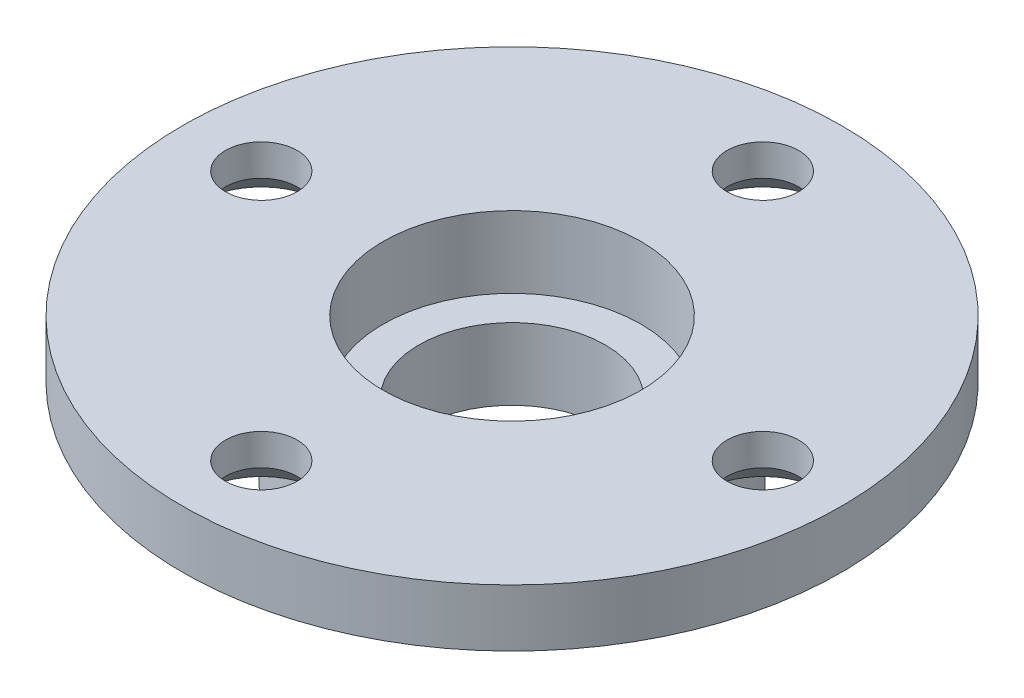
ISO-10303-21;
HEADER;
FILE_DESCRIPTION(('STEP AP214'),'2;1');
FILE_NAME('part.step','',(''),(''),'','','');
FILE_SCHEMA(('AUTOMOTIVE_DESIGN { 1 0 10303 214 1 1 1 1 }'));
ENDSEC;
DATA;
#1=APPLICATION_CONTEXT('core data for automotive mechanical design processes');
#2=APPLICATION_PROTOCOL_DEFINITION('international standard','automotive_design',2000,#1);
#3=PRODUCT_CONTEXT('',#1,'mechanical');
#4=PRODUCT('Part','Part','',(#3));
#5=PRODUCT_RELATED_PRODUCT_CATEGORY('part','',(#4));
#6=PRODUCT_DEFINITION_FORMATION('','',#4);
#7=PRODUCT_DEFINITION_CONTEXT('part definition',#1,'design');
#8=PRODUCT_DEFINITION('design','',#6,#7);
#9=PRODUCT_DEFINITION_SHAPE('','',#8);
#10=(LENGTH_UNIT() NAMED_UNIT(*) SI_UNIT(.MILLI.,.METRE.));
#11=(NAMED_UNIT(*) PLANE_ANGLE_UNIT() SI_UNIT($,.RADIAN.));
#12=(NAMED_UNIT(*) SI_UNIT($,.STERADIAN.) SOLID_ANGLE_UNIT());
#13=UNCERTAINTY_MEASURE_WITH_UNIT(LENGTH_MEASURE(1.E-05),#10,'distance_accuracy_value','');
#14=(GEOMETRIC_REPRESENTATION_CONTEXT(3) GLOBAL_UNCERTAINTY_ASSIGNED_CONTEXT((#13)) GLOBAL_UNIT_ASSIGNED_CONTEXT((#10,
#11,#12)) REPRESENTATION_CONTEXT('',''));
#15=CARTESIAN_POINT('',(0.,0.,0.));
#16=DIRECTION('',(0.,0.,1.));
#17=DIRECTION('',(1.,0.,0.));
#18=AXIS2_PLACEMENT_3D('',#15,#16,#17);
#19=CARTESIAN_POINT('',(0.,0.,0.));
#20=DIRECTION('',(0.,-1.,0.));
#21=DIRECTION('',(0.,0.,-1.));
#22=AXIS2_PLACEMENT_3D('',#19,#20,#21);
#23=CYLINDRICAL_SURFACE('',#22,6.5);
#24=CARTESIAN_POINT('',(0.,0.,0.));
#25=DIRECTION('',(0.,-1.,0.));
#26=DIRECTION('',(0.,0.,-1.));
#27=AXIS2_PLACEMENT_3D('',#24,#25,#26);
#28=CIRCLE('',#27,6.5);
#29=CARTESIAN_POINT('',(0.,0.,-6.5));
#30=VERTEX_POINT('',#29);
#31=EDGE_CURVE('E69',#30,#30,#28,.T.);
#32=ORIENTED_EDGE('',*,*,#31,.T.);
#33=EDGE_LOOP('',(#32));
#34=FACE_BOUND('',#33,.T.);
#35=CARTESIAN_POINT('',(0.,5.,0.));
#36=DIRECTION('',(0.,-1.,0.));
#37=DIRECTION('',(0.,0.,-1.));
#38=AXIS2_PLACEMENT_3D('',#35,#36,#37);
#39=CIRCLE('',#38,6.5);
#40=CARTESIAN_POINT('',(0.,5.,-6.5));
#41=VERTEX_POINT('',#40);
#42=EDGE_CURVE('E90',#41,#41,#39,.T.);
#43=ORIENTED_EDGE('',*,*,#42,.F.);
#44=EDGE_LOOP('',(#43));
#45=FACE_BOUND('',#44,.T.);
#46=ADVANCED_FACE('F36',(#34,#45),#23,.F.);
#47=CARTESIAN_POINT('',(6.5,0.,0.));
#48=DIRECTION('',(0.,-1.,0.));
#49=DIRECTION('',(0.,0.,-1.));
#50=AXIS2_PLACEMENT_3D('',#47,#48,#49);
#51=PLANE('',#50);
#52=CARTESIAN_POINT('',(0.,0.,0.));
#53=DIRECTION('',(0.,-1.,0.));
#54=DIRECTION('',(0.,0.,-1.));
#55=AXIS2_PLACEMENT_3D('',#52,#53,#54);
#56=CIRCLE('',#55,12.5);
#57=CARTESIAN_POINT('',(0.,0.,-12.5));
#58=VERTEX_POINT('',#57);
#59=EDGE_CURVE('E72',#58,#58,#56,.T.);
#60=ORIENTED_EDGE('',*,*,#59,.T.);
#61=EDGE_LOOP('',(#60));
#62=FACE_BOUND('',#61,.T.);
#63=ORIENTED_EDGE('',*,*,#31,.F.);
#64=EDGE_LOOP('',(#63));
#65=FACE_BOUND('',#64,.T.);
#66=ADVANCED_FACE('F138',(#62,#65),#51,.T.);
#67=CARTESIAN_POINT('',(0.,0.,0.));
#68=DIRECTION('',(0.,-1.,0.));
#69=DIRECTION('',(0.,0.,-1.));
#70=AXIS2_PLACEMENT_3D('',#67,#68,#69);
#71=CYLINDRICAL_SURFACE('',#70,12.5);
#72=CARTESIAN_POINT('',(0.,6.,0.));
#73=DIRECTION('',(0.,-1.,0.));
#74=DIRECTION('',(0.,0.,-1.));
#75=AXIS2_PLACEMENT_3D('',#72,#73,#74);
#76=CIRCLE('',#75,12.5);
#77=CARTESIAN_POINT('',(0.,6.,-12.5));
#78=VERTEX_POINT('',#77);
#79=EDGE_CURVE('E75',#78,#78,#76,.T.);
#80=ORIENTED_EDGE('',*,*,#79,.T.);
#81=EDGE_LOOP('',(#80));
#82=FACE_BOUND('',#81,.T.);
#83=ORIENTED_EDGE('',*,*,#59,.F.);
#84=EDGE_LOOP('',(#83));
#85=FACE_BOUND('',#84,.T.);
#86=ADVANCED_FACE('F132',(#82,#85),#71,.T.);
#87=CARTESIAN_POINT('',(12.5,6.,0.));
#88=DIRECTION('',(0.,-1.,0.));
#89=DIRECTION('',(0.,0.,-1.));
#90=AXIS2_PLACEMENT_3D('',#87,#88,#89);
#91=PLANE('',#90);
#92=CARTESIAN_POINT('',(1.83302770289265E-13,6.,-17.5));
#93=DIRECTION('',(0.,-1.,0.));
#94=DIRECTION('',(0.,0.,-1.));
#95=AXIS2_PLACEMENT_3D('',#92,#93,#94);
#96=CIRCLE('',#95,4.29999999999999);
#97=CARTESIAN_POINT('',(1.83302770289265E-13,6.,-21.8));
#98=VERTEX_POINT('',#97);
#99=EDGE_CURVE('E10',#98,#98,#96,.F.);
#100=ORIENTED_EDGE('',*,*,#99,.T.);
#101=EDGE_LOOP('',(#100));
#102=FACE_BOUND('',#101,.T.);
#103=CARTESIAN_POINT('',(-17.5,6.,0.));
#104=DIRECTION('',(0.,-1.,0.));
#105=DIRECTION('',(0.,0.,-1.));
#106=AXIS2_PLACEMENT_3D('',#103,#104,#105);
#107=CIRCLE('',#106,4.29999999999999);
#108=CARTESIAN_POINT('',(-17.5,6.,-4.29999999999999));
#109=VERTEX_POINT('',#108);
#110=EDGE_CURVE('E48',#109,#109,#107,.F.);
#111=ORIENTED_EDGE('',*,*,#110,.T.);
#112=EDGE_LOOP('',(#111));
#113=FACE_BOUND('',#112,.T.);
#114=CARTESIAN_POINT('',(0.,6.,17.5));
#115=DIRECTION('',(0.,-1.,0.));
#116=DIRECTION('',(0.,0.,-1.));
#117=AXIS2_PLACEMENT_3D('',#114,#115,#116);
#118=CIRCLE('',#117,4.29999999999999);
#119=CARTESIAN_POINT('',(0.,6.,13.2));
#120=VERTEX_POINT('',#119);
#121=EDGE_CURVE('E57',#120,#120,#118,.F.);
#122=ORIENTED_EDGE('',*,*,#121,.T.);
#123=EDGE_LOOP('',(#122));
#124=FACE_BOUND('',#123,.T.);
#125=CARTESIAN_POINT('',(17.5,6.,0.));
#126=DIRECTION('',(0.,-1.,0.));
#127=DIRECTION('',(0.,0.,-1.));
#128=AXIS2_PLACEMENT_3D('',#125,#126,#127);
#129=CIRCLE('',#128,4.3);
#130=CARTESIAN_POINT('',(17.5,6.,-4.3));
#131=VERTEX_POINT('',#130);
#132=EDGE_CURVE('E63',#131,#131,#129,.F.);
#133=ORIENTED_EDGE('',*,*,#132,.T.);
#134=EDGE_LOOP('',(#133));
#135=FACE_BOUND('',#134,.T.);
#136=CARTESIAN_POINT('',(0.,6.,0.));
#137=DIRECTION('',(0.,-1.,0.));
#138=DIRECTION('',(0.,0.,-1.));
#139=AXIS2_PLACEMENT_3D('',#136,#137,#138);
#140=CIRCLE('',#139,23.);
#141=CARTESIAN_POINT('',(0.,6.,-23.));
#142=VERTEX_POINT('',#141);
#143=EDGE_CURVE('E78',#142,#142,#140,.T.);
#144=ORIENTED_EDGE('',*,*,#143,.T.);
#145=EDGE_LOOP('',(#144));
#146=FACE_BOUND('',#145,.T.);
#147=ORIENTED_EDGE('',*,*,#79,.F.);
#148=EDGE_LOOP('',(#147));
#149=FACE_BOUND('',#148,.T.);
#150=ADVANCED_FACE('F126',(#102,#113,#124,#135,#146,#149),#91,.T.);
#151=CARTESIAN_POINT('',(0.,0.,0.));
#152=DIRECTION('',(0.,-1.,0.));
#153=DIRECTION('',(0.,0.,-1.));
#154=AXIS2_PLACEMENT_3D('',#151,#152,#153);
#155=CYLINDRICAL_SURFACE('',#154,23.);
#156=CARTESIAN_POINT('',(0.,10.,0.));
#157=DIRECTION('',(0.,-1.,0.));
#158=DIRECTION('',(0.,0.,-1.));
#159=AXIS2_PLACEMENT_3D('',#156,#157,#158);
#160=CIRCLE('',#159,23.);
#161=CARTESIAN_POINT('',(0.,10.,-23.));
#162=VERTEX_POINT('',#161);
#163=EDGE_CURVE('E81',#162,#162,#160,.T.);
#164=ORIENTED_EDGE('',*,*,#163,.T.);
#165=EDGE_LOOP('',(#164));
#166=FACE_BOUND('',#165,.T.);
#167=ORIENTED_EDGE('',*,*,#143,.F.);
#168=EDGE_LOOP('',(#167));
#169=FACE_BOUND('',#168,.T.);
#170=ADVANCED_FACE('F112',(#166,#169),#155,.T.);
#171=CARTESIAN_POINT('',(23.,10.,0.));
#172=DIRECTION('',(0.,1.,0.));
#173=DIRECTION('',(0.,0.,1.));
#174=AXIS2_PLACEMENT_3D('',#171,#172,#173);
#175=PLANE('',#174);
#176=CARTESIAN_POINT('',(1.83302770289265E-13,10.,-17.5));
#177=DIRECTION('',(0.,1.,0.));
#178=DIRECTION('',(0.,0.,1.));
#179=AXIS2_PLACEMENT_3D('',#176,#177,#178);
#180=CIRCLE('',#179,2.5);
#181=CARTESIAN_POINT('',(1.83302770289265E-13,10.,-15.));
#182=VERTEX_POINT('',#181);
#183=EDGE_CURVE('E102',#182,#182,#180,.T.);
#184=ORIENTED_EDGE('',*,*,#183,.F.);
#185=EDGE_LOOP('',(#184));
#186=FACE_BOUND('',#185,.T.);
#187=CARTESIAN_POINT('',(-17.5,10.,0.));
#188=DIRECTION('',(0.,1.,0.));
#189=DIRECTION('',(0.,0.,1.));
#190=AXIS2_PLACEMENT_3D('',#187,#188,#189);
#191=CIRCLE('',#190,2.5);
#192=CARTESIAN_POINT('',(-17.5,10.,2.5));
#193=VERTEX_POINT('',#192);
#194=EDGE_CURVE('E99',#193,#193,#191,.T.);
#195=ORIENTED_EDGE('',*,*,#194,.F.);
#196=EDGE_LOOP('',(#195));
#197=FACE_BOUND('',#196,.T.);
#198=CARTESIAN_POINT('',(0.,10.,17.5));
#199=DIRECTION('',(0.,1.,0.));
#200=DIRECTION('',(0.,0.,1.));
#201=AXIS2_PLACEMENT_3D('',#198,#199,#200);
#202=CIRCLE('',#201,2.5);
#203=CARTESIAN_POINT('',(0.,10.,20.));
#204=VERTEX_POINT('',#203);
#205=EDGE_CURVE('E96',#204,#204,#202,.T.);
#206=ORIENTED_EDGE('',*,*,#205,.F.);
#207=EDGE_LOOP('',(#206));
#208=FACE_BOUND('',#207,.T.);
#209=CARTESIAN_POINT('',(17.5,10.,0.));
#210=DIRECTION('',(0.,1.,0.));
#211=DIRECTION('',(0.,0.,1.));
#212=AXIS2_PLACEMENT_3D('',#209,#210,#211);
#213=CIRCLE('',#212,2.5);
#214=CARTESIAN_POINT('',(17.5,10.,2.5));
#215=VERTEX_POINT('',#214);
#216=EDGE_CURVE('E93',#215,#215,#213,.T.);
#217=ORIENTED_EDGE('',*,*,#216,.F.);
#218=EDGE_LOOP('',(#217));
#219=FACE_BOUND('',#218,.T.);
#220=CARTESIAN_POINT('',(0.,10.,0.));
#221=DIRECTION('',(0.,-1.,0.));
#222=DIRECTION('',(0.,0.,-1.));
#223=AXIS2_PLACEMENT_3D('',#220,#221,#222);
#224=CIRCLE('',#223,9.);
#225=CARTESIAN_POINT('',(0.,10.,-9.));
#226=VERTEX_POINT('',#225);
#227=EDGE_CURVE('E84',#226,#226,#224,.T.);
#228=ORIENTED_EDGE('',*,*,#227,.T.);
#229=EDGE_LOOP('',(#228));
#230=FACE_BOUND('',#229,.T.);
#231=ORIENTED_EDGE('',*,*,#163,.F.);
#232=EDGE_LOOP('',(#231));
#233=FACE_BOUND('',#232,.T.);
#234=ADVANCED_FACE('F108',(#186,#197,#208,#219,#230,#233),#175,.T.);
#235=CARTESIAN_POINT('',(0.,0.,0.));
#236=DIRECTION('',(0.,-1.,0.));
#237=DIRECTION('',(0.,0.,-1.));
#238=AXIS2_PLACEMENT_3D('',#235,#236,#237);
#239=CYLINDRICAL_SURFACE('',#238,9.);
#240=CARTESIAN_POINT('',(0.,5.,0.));
#241=DIRECTION('',(0.,-1.,0.));
#242=DIRECTION('',(0.,0.,-1.));
#243=AXIS2_PLACEMENT_3D('',#240,#241,#242);
#244=CIRCLE('',#243,9.);
#245=CARTESIAN_POINT('',(0.,5.,-9.));
#246=VERTEX_POINT('',#245);
#247=EDGE_CURVE('E87',#246,#246,#244,.T.);
#248=ORIENTED_EDGE('',*,*,#247,.T.);
#249=EDGE_LOOP('',(#248));
#250=FACE_BOUND('',#249,.T.);
#251=ORIENTED_EDGE('',*,*,#227,.F.);
#252=EDGE_LOOP('',(#251));
#253=FACE_BOUND('',#252,.T.);
#254=ADVANCED_FACE('F111',(#250,#253),#239,.F.);
#255=CARTESIAN_POINT('',(9.,5.,0.));
#256=DIRECTION('',(0.,1.,0.));
#257=DIRECTION('',(0.,0.,1.));
#258=AXIS2_PLACEMENT_3D('',#255,#256,#257);
#259=PLANE('',#258);
#260=ORIENTED_EDGE('',*,*,#42,.T.);
#261=EDGE_LOOP('',(#260));
#262=FACE_BOUND('',#261,.T.);
#263=ORIENTED_EDGE('',*,*,#247,.F.);
#264=EDGE_LOOP('',(#263));
#265=FACE_BOUND('',#264,.T.);
#266=ADVANCED_FACE('F152',(#262,#265),#259,.T.);
#267=CARTESIAN_POINT('',(17.5,10.,0.));
#268=DIRECTION('',(0.,1.,0.));
#269=DIRECTION('',(0.,0.,1.));
#270=AXIS2_PLACEMENT_3D('',#267,#268,#269);
#271=CYLINDRICAL_SURFACE('',#270,2.5);
#272=CARTESIAN_POINT('',(17.5,7.79999999999999,0.));
#273=DIRECTION('',(0.,-1.,0.));
#274=DIRECTION('',(0.,0.,-1.));
#275=AXIS2_PLACEMENT_3D('',#272,#273,#274);
#276=CIRCLE('',#275,2.5);
#277=CARTESIAN_POINT('',(17.5,7.79999999999999,-2.5));
#278=VERTEX_POINT('',#277);
#279=EDGE_CURVE('E66',#278,#278,#276,.T.);
#280=ORIENTED_EDGE('',*,*,#279,.T.);
#281=EDGE_LOOP('',(#280));
#282=FACE_BOUND('',#281,.T.);
#283=ORIENTED_EDGE('',*,*,#216,.T.);
#284=EDGE_LOOP('',(#283));
#285=FACE_BOUND('',#284,.T.);
#286=ADVANCED_FACE('F155',(#282,#285),#271,.F.);
#287=CARTESIAN_POINT('',(17.5,7.79999999999999,0.));
#288=DIRECTION('',(0.,-1.,0.));
#289=DIRECTION('',(0.,0.,-1.));
#290=AXIS2_PLACEMENT_3D('',#287,#288,#289);
#291=CONICAL_SURFACE('',#290,2.5,0.785398163397452);
#292=ORIENTED_EDGE('',*,*,#132,.F.);
#293=EDGE_LOOP('',(#292));
#294=FACE_BOUND('',#293,.T.);
#295=ORIENTED_EDGE('',*,*,#279,.F.);
#296=EDGE_LOOP('',(#295));
#297=FACE_BOUND('',#296,.T.);
#298=ADVANCED_FACE('F167',(#294,#297),#291,.F.);
#299=CARTESIAN_POINT('',(0.,10.,17.5));
#300=DIRECTION('',(0.,1.,0.));
#301=DIRECTION('',(0.,0.,1.));
#302=AXIS2_PLACEMENT_3D('',#299,#300,#301);
#303=CYLINDRICAL_SURFACE('',#302,2.5);
#304=CARTESIAN_POINT('',(0.,7.8,17.5));
#305=DIRECTION('',(0.,-1.,0.));
#306=DIRECTION('',(0.,0.,-1.));
#307=AXIS2_PLACEMENT_3D('',#304,#305,#306);
#308=CIRCLE('',#307,2.5);
#309=CARTESIAN_POINT('',(0.,7.8,15.));
#310=VERTEX_POINT('',#309);
#311=EDGE_CURVE('E60',#310,#310,#308,.T.);
#312=ORIENTED_EDGE('',*,*,#311,.T.);
#313=EDGE_LOOP('',(#312));
#314=FACE_BOUND('',#313,.T.);
#315=ORIENTED_EDGE('',*,*,#205,.T.);
#316=EDGE_LOOP('',(#315));
#317=FACE_BOUND('',#316,.T.);
#318=ADVANCED_FACE('F173',(#314,#317),#303,.F.);
#319=CARTESIAN_POINT('',(-17.5,10.,0.));
#320=DIRECTION('',(0.,1.,0.));
#321=DIRECTION('',(0.,0.,1.));
#322=AXIS2_PLACEMENT_3D('',#319,#320,#321);
#323=CYLINDRICAL_SURFACE('',#322,2.5);
#324=CARTESIAN_POINT('',(-17.5,7.8,0.));
#325=DIRECTION('',(0.,-1.,0.));
#326=DIRECTION('',(0.,0.,-1.));
#327=AXIS2_PLACEMENT_3D('',#324,#325,#326);
#328=CIRCLE('',#327,2.5);
#329=CARTESIAN_POINT('',(-17.5,7.8,-2.5));
#330=VERTEX_POINT('',#329);
#331=EDGE_CURVE('E52',#330,#330,#328,.T.);
#332=ORIENTED_EDGE('',*,*,#331,.T.);
#333=EDGE_LOOP('',(#332));
#334=FACE_BOUND('',#333,.T.);
#335=ORIENTED_EDGE('',*,*,#194,.T.);
#336=EDGE_LOOP('',(#335));
#337=FACE_BOUND('',#336,.T.);
#338=ADVANCED_FACE('F194',(#334,#337),#323,.F.);
#339=CARTESIAN_POINT('',(1.83302770289265E-13,10.,-17.5));
#340=DIRECTION('',(0.,1.,0.));
#341=DIRECTION('',(0.,0.,1.));
#342=AXIS2_PLACEMENT_3D('',#339,#340,#341);
#343=CYLINDRICAL_SURFACE('',#342,2.5);
#344=CARTESIAN_POINT('',(1.83302770289265E-13,7.8,-17.5));
#345=DIRECTION('',(0.,-1.,0.));
#346=DIRECTION('',(0.,0.,-1.));
#347=AXIS2_PLACEMENT_3D('',#344,#345,#346);
#348=CIRCLE('',#347,2.5);
#349=CARTESIAN_POINT('',(1.83302770289265E-13,7.8,-20.));
#350=VERTEX_POINT('',#349);
#351=EDGE_CURVE('E44',#350,#350,#348,.T.);
#352=ORIENTED_EDGE('',*,*,#351,.T.);
#353=EDGE_LOOP('',(#352));
#354=FACE_BOUND('',#353,.T.);
#355=ORIENTED_EDGE('',*,*,#183,.T.);
#356=EDGE_LOOP('',(#355));
#357=FACE_BOUND('',#356,.T.);
#358=ADVANCED_FACE('F106',(#354,#357),#343,.F.);
#359=CARTESIAN_POINT('',(0.,7.8,17.5));
#360=DIRECTION('',(0.,-1.,0.));
#361=DIRECTION('',(0.,0.,-1.));
#362=AXIS2_PLACEMENT_3D('',#359,#360,#361);
#363=CONICAL_SURFACE('',#362,2.5,0.785398163397448);
#364=ORIENTED_EDGE('',*,*,#121,.F.);
#365=EDGE_LOOP('',(#364));
#366=FACE_BOUND('',#365,.T.);
#367=ORIENTED_EDGE('',*,*,#311,.F.);
#368=EDGE_LOOP('',(#367));
#369=FACE_BOUND('',#368,.T.);
#370=ADVANCED_FACE('F175',(#366,#369),#363,.F.);
#371=CARTESIAN_POINT('',(-17.5,7.8,0.));
#372=DIRECTION('',(0.,-1.,0.));
#373=DIRECTION('',(0.,0.,-1.));
#374=AXIS2_PLACEMENT_3D('',#371,#372,#373);
#375=CONICAL_SURFACE('',#374,2.5,0.785398163397448);
#376=ORIENTED_EDGE('',*,*,#110,.F.);
#377=EDGE_LOOP('',(#376));
#378=FACE_BOUND('',#377,.T.);
#379=ORIENTED_EDGE('',*,*,#331,.F.);
#380=EDGE_LOOP('',(#379));
#381=FACE_BOUND('',#380,.T.);
#382=ADVANCED_FACE('F180',(#378,#381),#375,.F.);
#383=CARTESIAN_POINT('',(1.83302770289265E-13,7.8,-17.5));
#384=DIRECTION('',(0.,-1.,0.));
#385=DIRECTION('',(0.,0.,-1.));
#386=AXIS2_PLACEMENT_3D('',#383,#384,#385);
#387=CONICAL_SURFACE('',#386,2.5,0.785398163397448);
#388=ORIENTED_EDGE('',*,*,#99,.F.);
#389=EDGE_LOOP('',(#388));
#390=FACE_BOUND('',#389,.T.);
#391=ORIENTED_EDGE('',*,*,#351,.F.);
#392=EDGE_LOOP('',(#391));
#393=FACE_BOUND('',#392,.T.);
#394=ADVANCED_FACE('F39',(#390,#393),#387,.F.);
#395=CLOSED_SHELL('',(#46,#66,#86,#150,#170,#234,#254,#266,#286,#298,#318,#338,#358,#370,#382,#394));
#396=MANIFOLD_SOLID_BREP('B2',#395);
#397=ADVANCED_BREP_SHAPE_REPRESENTATION('',(#18,#396),#14);
#398=SHAPE_DEFINITION_REPRESENTATION(#9,#397);
ENDSEC;
END-ISO-10303-21;
